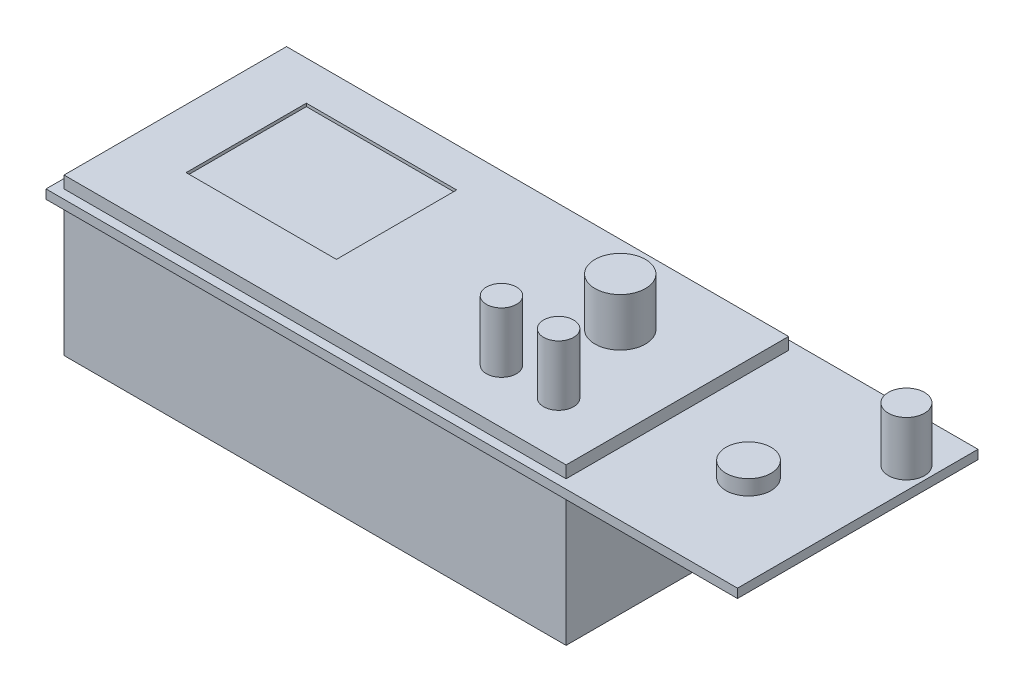
ISO-10303-21;
HEADER;
FILE_DESCRIPTION(('STEP AP214'),'2;1');
FILE_NAME('part.step','',(''),(''),'','','');
FILE_SCHEMA(('AUTOMOTIVE_DESIGN { 1 0 10303 214 1 1 1 1 }'));
ENDSEC;
DATA;
#1=APPLICATION_CONTEXT('core data for automotive mechanical design processes');
#2=APPLICATION_PROTOCOL_DEFINITION('international standard','automotive_design',2000,#1);
#3=PRODUCT_CONTEXT('',#1,'mechanical');
#4=PRODUCT('Part','Part','',(#3));
#5=PRODUCT_RELATED_PRODUCT_CATEGORY('part','',(#4));
#6=PRODUCT_DEFINITION_FORMATION('','',#4);
#7=PRODUCT_DEFINITION_CONTEXT('part definition',#1,'design');
#8=PRODUCT_DEFINITION('design','',#6,#7);
#9=PRODUCT_DEFINITION_SHAPE('','',#8);
#10=(LENGTH_UNIT() NAMED_UNIT(*) SI_UNIT(.MILLI.,.METRE.));
#11=(NAMED_UNIT(*) PLANE_ANGLE_UNIT() SI_UNIT($,.RADIAN.));
#12=(NAMED_UNIT(*) SI_UNIT($,.STERADIAN.) SOLID_ANGLE_UNIT());
#13=UNCERTAINTY_MEASURE_WITH_UNIT(LENGTH_MEASURE(1.E-05),#10,'distance_accuracy_value','');
#14=(GEOMETRIC_REPRESENTATION_CONTEXT(3) GLOBAL_UNCERTAINTY_ASSIGNED_CONTEXT((#13)) GLOBAL_UNIT_ASSIGNED_CONTEXT((#10,
#11,#12)) REPRESENTATION_CONTEXT('',''));
#15=CARTESIAN_POINT('',(0.,0.,0.));
#16=DIRECTION('',(0.,0.,1.));
#17=DIRECTION('',(1.,0.,0.));
#18=AXIS2_PLACEMENT_3D('',#15,#16,#17);
#19=CARTESIAN_POINT('',(0.,0.,0.));
#20=DIRECTION('',(0.,1.,0.));
#21=DIRECTION('',(0.,0.,1.));
#22=AXIS2_PLACEMENT_3D('',#19,#20,#21);
#23=PLANE('',#22);
#24=DIRECTION('',(0.,0.,1.));
#25=VECTOR('',#24,1.);
#26=CARTESIAN_POINT('',(-79.624134520277,0.,-38.2195845697328));
#27=LINE('',#26,#25);
#28=CARTESIAN_POINT('',(-79.624134520277,0.,-38.2195845697328));
#29=VERTEX_POINT('',#28);
#30=CARTESIAN_POINT('',(-79.624134520277,0.,41.7804154302672));
#31=VERTEX_POINT('',#30);
#32=EDGE_CURVE('E313',#29,#31,#27,.T.);
#33=ORIENTED_EDGE('',*,*,#32,.F.);
#34=DIRECTION('',(-1.,0.,0.));
#35=VECTOR('',#34,1.);
#36=CARTESIAN_POINT('',(-79.624134520277,0.,-38.2195845697328));
#37=LINE('',#36,#35);
#38=CARTESIAN_POINT('',(150.375865479723,0.,-38.2195845697328));
#39=VERTEX_POINT('',#38);
#40=EDGE_CURVE('E319',#39,#29,#37,.T.);
#41=ORIENTED_EDGE('',*,*,#40,.F.);
#42=DIRECTION('',(0.,0.,-1.));
#43=VECTOR('',#42,1.);
#44=CARTESIAN_POINT('',(150.375865479723,0.,-38.2195845697328));
#45=LINE('',#44,#43);
#46=CARTESIAN_POINT('',(150.375865479723,0.,41.7804154302672));
#47=VERTEX_POINT('',#46);
#48=EDGE_CURVE('E335',#47,#39,#45,.T.);
#49=ORIENTED_EDGE('',*,*,#48,.F.);
#50=DIRECTION('',(1.,0.,0.));
#51=VECTOR('',#50,1.);
#52=CARTESIAN_POINT('',(-79.624134520277,0.,41.7804154302672));
#53=LINE('',#52,#51);
#54=EDGE_CURVE('E332',#31,#47,#53,.T.);
#55=ORIENTED_EDGE('',*,*,#54,.F.);
#56=EDGE_LOOP('',(#33,#41,#49,#55));
#57=FACE_BOUND('',#56,.T.);
#58=DIRECTION('',(0.,0.,-1.));
#59=VECTOR('',#58,1.);
#60=CARTESIAN_POINT('',(-76.624134520277,0.,38.7804154302672));
#61=LINE('',#60,#59);
#62=CARTESIAN_POINT('',(-76.624134520277,0.,38.7804154302672));
#63=VERTEX_POINT('',#62);
#64=CARTESIAN_POINT('',(-76.6241345202769,0.,-35.2195845697328));
#65=VERTEX_POINT('',#64);
#66=EDGE_CURVE('E57',#63,#65,#61,.T.);
#67=ORIENTED_EDGE('',*,*,#66,.F.);
#68=DIRECTION('',(-1.,0.,0.));
#69=VECTOR('',#68,1.);
#70=CARTESIAN_POINT('',(-76.624134520277,0.,38.7804154302672));
#71=LINE('',#70,#69);
#72=CARTESIAN_POINT('',(90.375865479723,0.,38.7804154302672));
#73=VERTEX_POINT('',#72);
#74=EDGE_CURVE('E61',#73,#63,#71,.T.);
#75=ORIENTED_EDGE('',*,*,#74,.F.);
#76=DIRECTION('',(0.,0.,1.));
#77=VECTOR('',#76,1.);
#78=CARTESIAN_POINT('',(90.375865479723,0.,38.7804154302672));
#79=LINE('',#78,#77);
#80=CARTESIAN_POINT('',(90.3758654797231,0.,-35.2195845697328));
#81=VERTEX_POINT('',#80);
#82=EDGE_CURVE('E701',#81,#73,#79,.T.);
#83=ORIENTED_EDGE('',*,*,#82,.F.);
#84=DIRECTION('',(1.,0.,0.));
#85=VECTOR('',#84,1.);
#86=CARTESIAN_POINT('',(-76.6241345202769,0.,-35.2195845697328));
#87=LINE('',#86,#85);
#88=EDGE_CURVE('E711',#65,#81,#87,.T.);
#89=ORIENTED_EDGE('',*,*,#88,.F.);
#90=EDGE_LOOP('',(#67,#75,#83,#89));
#91=FACE_BOUND('',#90,.T.);
#92=ADVANCED_FACE('F41',(#57,#91),#23,.F.);
#93=CARTESIAN_POINT('',(-79.624134520277,3.,-38.2195845697328));
#94=DIRECTION('',(1.,0.,0.));
#95=DIRECTION('',(0.,0.,-1.));
#96=AXIS2_PLACEMENT_3D('',#93,#94,#95);
#97=PLANE('',#96);
#98=ORIENTED_EDGE('',*,*,#32,.T.);
#99=DIRECTION('',(0.,-1.,0.));
#100=VECTOR('',#99,1.);
#101=CARTESIAN_POINT('',(-79.624134520277,3.,41.7804154302672));
#102=LINE('',#101,#100);
#103=CARTESIAN_POINT('',(-79.624134520277,3.,41.7804154302672));
#104=VERTEX_POINT('',#103);
#105=EDGE_CURVE('E11',#104,#31,#102,.T.);
#106=ORIENTED_EDGE('',*,*,#105,.F.);
#107=DIRECTION('',(0.,0.,1.));
#108=VECTOR('',#107,1.);
#109=CARTESIAN_POINT('',(-79.624134520277,3.,-38.2195845697328));
#110=LINE('',#109,#108);
#111=CARTESIAN_POINT('',(-79.624134520277,3.,-38.2195845697328));
#112=VERTEX_POINT('',#111);
#113=EDGE_CURVE('E314',#112,#104,#110,.T.);
#114=ORIENTED_EDGE('',*,*,#113,.F.);
#115=DIRECTION('',(0.,-1.,0.));
#116=VECTOR('',#115,1.);
#117=CARTESIAN_POINT('',(-79.624134520277,3.,-38.2195845697328));
#118=LINE('',#117,#116);
#119=EDGE_CURVE('E328',#112,#29,#118,.T.);
#120=ORIENTED_EDGE('',*,*,#119,.T.);
#121=EDGE_LOOP('',(#98,#106,#114,#120));
#122=FACE_BOUND('',#121,.T.);
#123=ADVANCED_FACE('F43',(#122),#97,.F.);
#124=CARTESIAN_POINT('',(-79.624134520277,3.,41.7804154302672));
#125=DIRECTION('',(0.,0.,-1.));
#126=DIRECTION('',(-1.,0.,0.));
#127=AXIS2_PLACEMENT_3D('',#124,#125,#126);
#128=PLANE('',#127);
#129=ORIENTED_EDGE('',*,*,#54,.T.);
#130=DIRECTION('',(0.,-1.,0.));
#131=VECTOR('',#130,1.);
#132=CARTESIAN_POINT('',(150.375865479723,3.,41.7804154302672));
#133=LINE('',#132,#131);
#134=CARTESIAN_POINT('',(150.375865479723,3.,41.7804154302672));
#135=VERTEX_POINT('',#134);
#136=EDGE_CURVE('E50',#135,#47,#133,.T.);
#137=ORIENTED_EDGE('',*,*,#136,.F.);
#138=DIRECTION('',(1.,0.,0.));
#139=VECTOR('',#138,1.);
#140=CARTESIAN_POINT('',(-79.624134520277,3.,41.7804154302672));
#141=LINE('',#140,#139);
#142=EDGE_CURVE('E318',#104,#135,#141,.T.);
#143=ORIENTED_EDGE('',*,*,#142,.F.);
#144=ORIENTED_EDGE('',*,*,#105,.T.);
#145=EDGE_LOOP('',(#129,#137,#143,#144));
#146=FACE_BOUND('',#145,.T.);
#147=ADVANCED_FACE('F367',(#146),#128,.F.);
#148=CARTESIAN_POINT('',(150.375865479723,3.,-38.2195845697328));
#149=DIRECTION('',(-1.,0.,0.));
#150=DIRECTION('',(0.,0.,1.));
#151=AXIS2_PLACEMENT_3D('',#148,#149,#150);
#152=PLANE('',#151);
#153=ORIENTED_EDGE('',*,*,#48,.T.);
#154=DIRECTION('',(0.,-1.,0.));
#155=VECTOR('',#154,1.);
#156=CARTESIAN_POINT('',(150.375865479723,3.,-38.2195845697328));
#157=LINE('',#156,#155);
#158=CARTESIAN_POINT('',(150.375865479723,3.,-38.2195845697328));
#159=VERTEX_POINT('',#158);
#160=EDGE_CURVE('E343',#159,#39,#157,.T.);
#161=ORIENTED_EDGE('',*,*,#160,.F.);
#162=DIRECTION('',(0.,0.,-1.));
#163=VECTOR('',#162,1.);
#164=CARTESIAN_POINT('',(150.375865479723,3.,-38.2195845697328));
#165=LINE('',#164,#163);
#166=EDGE_CURVE('E322',#135,#159,#165,.T.);
#167=ORIENTED_EDGE('',*,*,#166,.F.);
#168=ORIENTED_EDGE('',*,*,#136,.T.);
#169=EDGE_LOOP('',(#153,#161,#167,#168));
#170=FACE_BOUND('',#169,.T.);
#171=ADVANCED_FACE('F352',(#170),#152,.F.);
#172=CARTESIAN_POINT('',(-79.624134520277,3.,-38.2195845697328));
#173=DIRECTION('',(0.,0.,1.));
#174=DIRECTION('',(1.,0.,0.));
#175=AXIS2_PLACEMENT_3D('',#172,#173,#174);
#176=PLANE('',#175);
#177=ORIENTED_EDGE('',*,*,#40,.T.);
#178=ORIENTED_EDGE('',*,*,#119,.F.);
#179=DIRECTION('',(-1.,0.,0.));
#180=VECTOR('',#179,1.);
#181=CARTESIAN_POINT('',(-79.624134520277,3.,-38.2195845697328));
#182=LINE('',#181,#180);
#183=EDGE_CURVE('E325',#159,#112,#182,.T.);
#184=ORIENTED_EDGE('',*,*,#183,.F.);
#185=ORIENTED_EDGE('',*,*,#160,.T.);
#186=EDGE_LOOP('',(#177,#178,#184,#185));
#187=FACE_BOUND('',#186,.T.);
#188=ADVANCED_FACE('F360',(#187),#176,.F.);
#189=CARTESIAN_POINT('',(0.,3.,0.));
#190=DIRECTION('',(0.,1.,0.));
#191=DIRECTION('',(0.,0.,1.));
#192=AXIS2_PLACEMENT_3D('',#189,#190,#191);
#193=PLANE('',#192);
#194=CARTESIAN_POINT('',(120.375865479723,3.,8.10842044145851));
#195=DIRECTION('',(0.,1.,0.));
#196=DIRECTION('',(0.,0.,1.));
#197=AXIS2_PLACEMENT_3D('',#194,#195,#196);
#198=CIRCLE('',#197,7.50000000000003);
#199=CARTESIAN_POINT('',(120.375865479723,3.,15.6084204414585));
#200=VERTEX_POINT('',#199);
#201=EDGE_CURVE('E178',#200,#200,#198,.T.);
#202=ORIENTED_EDGE('',*,*,#201,.F.);
#203=EDGE_LOOP('',(#202));
#204=FACE_BOUND('',#203,.T.);
#205=CARTESIAN_POINT('',(143.075865479723,3.,-21.7195845697328));
#206=DIRECTION('',(0.,1.,0.));
#207=DIRECTION('',(0.,0.,1.));
#208=AXIS2_PLACEMENT_3D('',#205,#206,#207);
#209=CIRCLE('',#208,6.00000000000002);
#210=CARTESIAN_POINT('',(143.075865479723,3.,-15.7195845697328));
#211=VERTEX_POINT('',#210);
#212=EDGE_CURVE('E191',#211,#211,#209,.T.);
#213=ORIENTED_EDGE('',*,*,#212,.F.);
#214=EDGE_LOOP('',(#213));
#215=FACE_BOUND('',#214,.T.);
#216=DIRECTION('',(0.,0.,1.));
#217=VECTOR('',#216,1.);
#218=CARTESIAN_POINT('',(-76.624134520277,3.,-35.2195845697328));
#219=LINE('',#218,#217);
#220=CARTESIAN_POINT('',(-76.624134520277,3.,-35.2195845697328));
#221=VERTEX_POINT('',#220);
#222=CARTESIAN_POINT('',(-76.6241345202769,3.,38.7804154302672));
#223=VERTEX_POINT('',#222);
#224=EDGE_CURVE('E259',#221,#223,#219,.T.);
#225=ORIENTED_EDGE('',*,*,#224,.F.);
#226=DIRECTION('',(-1.,0.,0.));
#227=VECTOR('',#226,1.);
#228=CARTESIAN_POINT('',(-76.624134520277,3.,-35.2195845697328));
#229=LINE('',#228,#227);
#230=CARTESIAN_POINT('',(90.375865479723,3.,-35.2195845697328));
#231=VERTEX_POINT('',#230);
#232=EDGE_CURVE('E274',#231,#221,#229,.T.);
#233=ORIENTED_EDGE('',*,*,#232,.F.);
#234=DIRECTION('',(0.,0.,-1.));
#235=VECTOR('',#234,1.);
#236=CARTESIAN_POINT('',(90.375865479723,3.,-35.2195845697328));
#237=LINE('',#236,#235);
#238=CARTESIAN_POINT('',(90.3758654797231,3.,38.7804154302672));
#239=VERTEX_POINT('',#238);
#240=EDGE_CURVE('E291',#239,#231,#237,.T.);
#241=ORIENTED_EDGE('',*,*,#240,.F.);
#242=DIRECTION('',(1.,0.,0.));
#243=VECTOR('',#242,1.);
#244=CARTESIAN_POINT('',(-76.6241345202769,3.,38.7804154302672));
#245=LINE('',#244,#243);
#246=EDGE_CURVE('E287',#223,#239,#245,.T.);
#247=ORIENTED_EDGE('',*,*,#246,.F.);
#248=EDGE_LOOP('',(#225,#233,#241,#247));
#249=FACE_BOUND('',#248,.T.);
#250=ORIENTED_EDGE('',*,*,#113,.T.);
#251=ORIENTED_EDGE('',*,*,#142,.T.);
#252=ORIENTED_EDGE('',*,*,#166,.T.);
#253=ORIENTED_EDGE('',*,*,#183,.T.);
#254=EDGE_LOOP('',(#250,#251,#252,#253));
#255=FACE_BOUND('',#254,.T.);
#256=ADVANCED_FACE('F366',(#204,#215,#249,#255),#193,.T.);
#257=CARTESIAN_POINT('',(-76.624134520277,7.,-35.2195845697328));
#258=DIRECTION('',(1.,0.,0.));
#259=DIRECTION('',(0.,0.,-1.));
#260=AXIS2_PLACEMENT_3D('',#257,#258,#259);
#261=PLANE('',#260);
#262=ORIENTED_EDGE('',*,*,#224,.T.);
#263=DIRECTION('',(0.,-1.,0.));
#264=VECTOR('',#263,1.);
#265=CARTESIAN_POINT('',(-76.6241345202769,7.,38.7804154302672));
#266=LINE('',#265,#264);
#267=CARTESIAN_POINT('',(-76.6241345202769,7.,38.7804154302672));
#268=VERTEX_POINT('',#267);
#269=EDGE_CURVE('E309',#268,#223,#266,.T.);
#270=ORIENTED_EDGE('',*,*,#269,.F.);
#271=DIRECTION('',(0.,0.,1.));
#272=VECTOR('',#271,1.);
#273=CARTESIAN_POINT('',(-76.624134520277,7.,-35.2195845697328));
#274=LINE('',#273,#272);
#275=CARTESIAN_POINT('',(-76.624134520277,7.,-35.2195845697328));
#276=VERTEX_POINT('',#275);
#277=EDGE_CURVE('E269',#276,#268,#274,.T.);
#278=ORIENTED_EDGE('',*,*,#277,.F.);
#279=DIRECTION('',(0.,-1.,0.));
#280=VECTOR('',#279,1.);
#281=CARTESIAN_POINT('',(-76.624134520277,7.,-35.2195845697328));
#282=LINE('',#281,#280);
#283=EDGE_CURVE('E283',#276,#221,#282,.T.);
#284=ORIENTED_EDGE('',*,*,#283,.T.);
#285=EDGE_LOOP('',(#262,#270,#278,#284));
#286=FACE_BOUND('',#285,.T.);
#287=ADVANCED_FACE('F385',(#286),#261,.F.);
#288=CARTESIAN_POINT('',(-76.6241345202769,7.,38.7804154302672));
#289=DIRECTION('',(0.,0.,-1.));
#290=DIRECTION('',(-1.,0.,0.));
#291=AXIS2_PLACEMENT_3D('',#288,#289,#290);
#292=PLANE('',#291);
#293=ORIENTED_EDGE('',*,*,#246,.T.);
#294=DIRECTION('',(0.,-1.,0.));
#295=VECTOR('',#294,1.);
#296=CARTESIAN_POINT('',(90.3758654797231,7.,38.7804154302672));
#297=LINE('',#296,#295);
#298=CARTESIAN_POINT('',(90.3758654797231,7.,38.7804154302672));
#299=VERTEX_POINT('',#298);
#300=EDGE_CURVE('E305',#299,#239,#297,.T.);
#301=ORIENTED_EDGE('',*,*,#300,.F.);
#302=DIRECTION('',(1.,0.,0.));
#303=VECTOR('',#302,1.);
#304=CARTESIAN_POINT('',(-76.6241345202769,7.,38.7804154302672));
#305=LINE('',#304,#303);
#306=EDGE_CURVE('E273',#268,#299,#305,.T.);
#307=ORIENTED_EDGE('',*,*,#306,.F.);
#308=ORIENTED_EDGE('',*,*,#269,.T.);
#309=EDGE_LOOP('',(#293,#301,#307,#308));
#310=FACE_BOUND('',#309,.T.);
#311=ADVANCED_FACE('F390',(#310),#292,.F.);
#312=CARTESIAN_POINT('',(90.375865479723,7.,-35.2195845697328));
#313=DIRECTION('',(-1.,0.,0.));
#314=DIRECTION('',(0.,0.,1.));
#315=AXIS2_PLACEMENT_3D('',#312,#313,#314);
#316=PLANE('',#315);
#317=ORIENTED_EDGE('',*,*,#240,.T.);
#318=DIRECTION('',(0.,-1.,0.));
#319=VECTOR('',#318,1.);
#320=CARTESIAN_POINT('',(90.375865479723,7.,-35.2195845697328));
#321=LINE('',#320,#319);
#322=CARTESIAN_POINT('',(90.375865479723,7.,-35.2195845697328));
#323=VERTEX_POINT('',#322);
#324=EDGE_CURVE('E301',#323,#231,#321,.T.);
#325=ORIENTED_EDGE('',*,*,#324,.F.);
#326=DIRECTION('',(0.,0.,-1.));
#327=VECTOR('',#326,1.);
#328=CARTESIAN_POINT('',(90.375865479723,7.,-35.2195845697328));
#329=LINE('',#328,#327);
#330=EDGE_CURVE('E277',#299,#323,#329,.T.);
#331=ORIENTED_EDGE('',*,*,#330,.F.);
#332=ORIENTED_EDGE('',*,*,#300,.T.);
#333=EDGE_LOOP('',(#317,#325,#331,#332));
#334=FACE_BOUND('',#333,.T.);
#335=ADVANCED_FACE('F408',(#334),#316,.F.);
#336=CARTESIAN_POINT('',(-76.624134520277,7.,-35.2195845697328));
#337=DIRECTION('',(0.,0.,1.));
#338=DIRECTION('',(1.,0.,0.));
#339=AXIS2_PLACEMENT_3D('',#336,#337,#338);
#340=PLANE('',#339);
#341=ORIENTED_EDGE('',*,*,#232,.T.);
#342=ORIENTED_EDGE('',*,*,#283,.F.);
#343=DIRECTION('',(-1.,0.,0.));
#344=VECTOR('',#343,1.);
#345=CARTESIAN_POINT('',(-76.624134520277,7.,-35.2195845697328));
#346=LINE('',#345,#344);
#347=EDGE_CURVE('E280',#323,#276,#346,.T.);
#348=ORIENTED_EDGE('',*,*,#347,.F.);
#349=ORIENTED_EDGE('',*,*,#324,.T.);
#350=EDGE_LOOP('',(#341,#342,#348,#349));
#351=FACE_BOUND('',#350,.T.);
#352=ADVANCED_FACE('F399',(#351),#340,.F.);
#353=CARTESIAN_POINT('',(0.,7.,0.));
#354=DIRECTION('',(0.,1.,0.));
#355=DIRECTION('',(0.,0.,1.));
#356=AXIS2_PLACEMENT_3D('',#353,#354,#355);
#357=PLANE('',#356);
#358=CARTESIAN_POINT('',(50.8758654797231,7.,20.7804154302672));
#359=DIRECTION('',(0.,1.,0.));
#360=DIRECTION('',(0.,0.,1.));
#361=AXIS2_PLACEMENT_3D('',#358,#359,#360);
#362=CIRCLE('',#361,5.);
#363=CARTESIAN_POINT('',(50.8758654797231,7.,25.7804154302672));
#364=VERTEX_POINT('',#363);
#365=EDGE_CURVE('E197',#364,#364,#362,.T.);
#366=ORIENTED_EDGE('',*,*,#365,.F.);
#367=EDGE_LOOP('',(#366));
#368=FACE_BOUND('',#367,.T.);
#369=CARTESIAN_POINT('',(69.8758654797231,7.,20.7804154302672));
#370=DIRECTION('',(0.,1.,0.));
#371=DIRECTION('',(0.,0.,1.));
#372=AXIS2_PLACEMENT_3D('',#369,#370,#371);
#373=CIRCLE('',#372,5.);
#374=CARTESIAN_POINT('',(69.8758654797231,7.,25.7804154302672));
#375=VERTEX_POINT('',#374);
#376=EDGE_CURVE('E205',#375,#375,#373,.T.);
#377=ORIENTED_EDGE('',*,*,#376,.F.);
#378=EDGE_LOOP('',(#377));
#379=FACE_BOUND('',#378,.T.);
#380=CARTESIAN_POINT('',(60.3758654797231,7.,-9.21958456973284));
#381=DIRECTION('',(0.,1.,0.));
#382=DIRECTION('',(0.,0.,1.));
#383=AXIS2_PLACEMENT_3D('',#380,#381,#382);
#384=CIRCLE('',#383,8.4);
#385=CARTESIAN_POINT('',(60.3758654797231,7.,-0.819584569732837));
#386=VERTEX_POINT('',#385);
#387=EDGE_CURVE('E213',#386,#386,#384,.T.);
#388=ORIENTED_EDGE('',*,*,#387,.F.);
#389=EDGE_LOOP('',(#388));
#390=FACE_BOUND('',#389,.T.);
#391=DIRECTION('',(0.,0.,1.));
#392=VECTOR('',#391,1.);
#393=CARTESIAN_POINT('',(-57.024134520277,7.,-22.2195845697328));
#394=LINE('',#393,#392);
#395=CARTESIAN_POINT('',(-57.024134520277,7.,-22.2195845697328));
#396=VERTEX_POINT('',#395);
#397=CARTESIAN_POINT('',(-57.0241345202769,7.,17.7804154302672));
#398=VERTEX_POINT('',#397);
#399=EDGE_CURVE('E221',#396,#398,#394,.T.);
#400=ORIENTED_EDGE('',*,*,#399,.F.);
#401=DIRECTION('',(-1.,0.,0.));
#402=VECTOR('',#401,1.);
#403=CARTESIAN_POINT('',(-57.024134520277,7.,-22.2195845697328));
#404=LINE('',#403,#402);
#405=CARTESIAN_POINT('',(-7.02413452027695,7.,-22.2195845697328));
#406=VERTEX_POINT('',#405);
#407=EDGE_CURVE('E230',#406,#396,#404,.T.);
#408=ORIENTED_EDGE('',*,*,#407,.F.);
#409=DIRECTION('',(0.,0.,-1.));
#410=VECTOR('',#409,1.);
#411=CARTESIAN_POINT('',(-7.02413452027695,7.,-22.2195845697328));
#412=LINE('',#411,#410);
#413=CARTESIAN_POINT('',(-7.02413452027694,7.,17.7804154302672));
#414=VERTEX_POINT('',#413);
#415=EDGE_CURVE('E249',#414,#406,#412,.T.);
#416=ORIENTED_EDGE('',*,*,#415,.F.);
#417=DIRECTION('',(1.,0.,0.));
#418=VECTOR('',#417,1.);
#419=CARTESIAN_POINT('',(-57.0241345202769,7.,17.7804154302672));
#420=LINE('',#419,#418);
#421=EDGE_CURVE('E245',#398,#414,#420,.T.);
#422=ORIENTED_EDGE('',*,*,#421,.F.);
#423=EDGE_LOOP('',(#400,#408,#416,#422));
#424=FACE_BOUND('',#423,.T.);
#425=ORIENTED_EDGE('',*,*,#277,.T.);
#426=ORIENTED_EDGE('',*,*,#306,.T.);
#427=ORIENTED_EDGE('',*,*,#330,.T.);
#428=ORIENTED_EDGE('',*,*,#347,.T.);
#429=EDGE_LOOP('',(#425,#426,#427,#428));
#430=FACE_BOUND('',#429,.T.);
#431=ADVANCED_FACE('F404',(#368,#379,#390,#424,#430),#357,.T.);
#432=CARTESIAN_POINT('',(-57.024134520277,6.,-22.2195845697328));
#433=DIRECTION('',(-1.,0.,0.));
#434=DIRECTION('',(0.,0.,1.));
#435=AXIS2_PLACEMENT_3D('',#432,#433,#434);
#436=PLANE('',#435);
#437=ORIENTED_EDGE('',*,*,#399,.T.);
#438=DIRECTION('',(0.,1.,0.));
#439=VECTOR('',#438,1.);
#440=CARTESIAN_POINT('',(-57.0241345202769,6.,17.7804154302672));
#441=LINE('',#440,#439);
#442=CARTESIAN_POINT('',(-57.0241345202769,6.,17.7804154302672));
#443=VERTEX_POINT('',#442);
#444=EDGE_CURVE('E242',#443,#398,#441,.T.);
#445=ORIENTED_EDGE('',*,*,#444,.F.);
#446=DIRECTION('',(0.,0.,1.));
#447=VECTOR('',#446,1.);
#448=CARTESIAN_POINT('',(-57.024134520277,6.,-22.2195845697328));
#449=LINE('',#448,#447);
#450=CARTESIAN_POINT('',(-57.024134520277,6.,-22.2195845697328));
#451=VERTEX_POINT('',#450);
#452=EDGE_CURVE('E225',#451,#443,#449,.T.);
#453=ORIENTED_EDGE('',*,*,#452,.F.);
#454=DIRECTION('',(0.,1.,0.));
#455=VECTOR('',#454,1.);
#456=CARTESIAN_POINT('',(-57.024134520277,6.,-22.2195845697328));
#457=LINE('',#456,#455);
#458=EDGE_CURVE('E256',#451,#396,#457,.T.);
#459=ORIENTED_EDGE('',*,*,#458,.T.);
#460=EDGE_LOOP('',(#437,#445,#453,#459));
#461=FACE_BOUND('',#460,.T.);
#462=ADVANCED_FACE('F421',(#461),#436,.F.);
#463=CARTESIAN_POINT('',(-57.024134520277,6.,-22.2195845697328));
#464=DIRECTION('',(0.,0.,-1.));
#465=DIRECTION('',(-1.,0.,0.));
#466=AXIS2_PLACEMENT_3D('',#463,#464,#465);
#467=PLANE('',#466);
#468=ORIENTED_EDGE('',*,*,#407,.T.);
#469=ORIENTED_EDGE('',*,*,#458,.F.);
#470=DIRECTION('',(-1.,0.,0.));
#471=VECTOR('',#470,1.);
#472=CARTESIAN_POINT('',(-57.024134520277,6.,-22.2195845697328));
#473=LINE('',#472,#471);
#474=CARTESIAN_POINT('',(-7.02413452027695,6.,-22.2195845697328));
#475=VERTEX_POINT('',#474);
#476=EDGE_CURVE('E238',#475,#451,#473,.T.);
#477=ORIENTED_EDGE('',*,*,#476,.F.);
#478=DIRECTION('',(0.,1.,0.));
#479=VECTOR('',#478,1.);
#480=CARTESIAN_POINT('',(-7.02413452027695,6.,-22.2195845697328));
#481=LINE('',#480,#479);
#482=EDGE_CURVE('E260',#475,#406,#481,.T.);
#483=ORIENTED_EDGE('',*,*,#482,.T.);
#484=EDGE_LOOP('',(#468,#469,#477,#483));
#485=FACE_BOUND('',#484,.T.);
#486=ADVANCED_FACE('F425',(#485),#467,.F.);
#487=CARTESIAN_POINT('',(-7.02413452027695,6.,-22.2195845697328));
#488=DIRECTION('',(1.,0.,0.));
#489=DIRECTION('',(0.,0.,-1.));
#490=AXIS2_PLACEMENT_3D('',#487,#488,#489);
#491=PLANE('',#490);
#492=ORIENTED_EDGE('',*,*,#415,.T.);
#493=ORIENTED_EDGE('',*,*,#482,.F.);
#494=DIRECTION('',(0.,0.,-1.));
#495=VECTOR('',#494,1.);
#496=CARTESIAN_POINT('',(-7.02413452027695,6.,-22.2195845697328));
#497=LINE('',#496,#495);
#498=CARTESIAN_POINT('',(-7.02413452027694,6.,17.7804154302672));
#499=VERTEX_POINT('',#498);
#500=EDGE_CURVE('E234',#499,#475,#497,.T.);
#501=ORIENTED_EDGE('',*,*,#500,.F.);
#502=DIRECTION('',(0.,1.,0.));
#503=VECTOR('',#502,1.);
#504=CARTESIAN_POINT('',(-7.02413452027694,6.,17.7804154302672));
#505=LINE('',#504,#503);
#506=EDGE_CURVE('E263',#499,#414,#505,.T.);
#507=ORIENTED_EDGE('',*,*,#506,.T.);
#508=EDGE_LOOP('',(#492,#493,#501,#507));
#509=FACE_BOUND('',#508,.T.);
#510=ADVANCED_FACE('F431',(#509),#491,.F.);
#511=CARTESIAN_POINT('',(-57.0241345202769,6.,17.7804154302672));
#512=DIRECTION('',(0.,0.,1.));
#513=DIRECTION('',(1.,0.,0.));
#514=AXIS2_PLACEMENT_3D('',#511,#512,#513);
#515=PLANE('',#514);
#516=ORIENTED_EDGE('',*,*,#421,.T.);
#517=ORIENTED_EDGE('',*,*,#506,.F.);
#518=DIRECTION('',(1.,0.,0.));
#519=VECTOR('',#518,1.);
#520=CARTESIAN_POINT('',(-57.0241345202769,6.,17.7804154302672));
#521=LINE('',#520,#519);
#522=EDGE_CURVE('E229',#443,#499,#521,.T.);
#523=ORIENTED_EDGE('',*,*,#522,.F.);
#524=ORIENTED_EDGE('',*,*,#444,.T.);
#525=EDGE_LOOP('',(#516,#517,#523,#524));
#526=FACE_BOUND('',#525,.T.);
#527=ADVANCED_FACE('F427',(#526),#515,.F.);
#528=CARTESIAN_POINT('',(0.,6.,0.));
#529=DIRECTION('',(0.,1.,0.));
#530=DIRECTION('',(0.,0.,1.));
#531=AXIS2_PLACEMENT_3D('',#528,#529,#530);
#532=PLANE('',#531);
#533=ORIENTED_EDGE('',*,*,#452,.T.);
#534=ORIENTED_EDGE('',*,*,#522,.T.);
#535=ORIENTED_EDGE('',*,*,#500,.T.);
#536=ORIENTED_EDGE('',*,*,#476,.T.);
#537=EDGE_LOOP('',(#533,#534,#535,#536));
#538=FACE_BOUND('',#537,.T.);
#539=ADVANCED_FACE('F430',(#538),#532,.T.);
#540=CARTESIAN_POINT('',(60.3758654797231,23.,-9.21958456973284));
#541=DIRECTION('',(0.,-1.,0.));
#542=DIRECTION('',(0.,0.,-1.));
#543=AXIS2_PLACEMENT_3D('',#540,#541,#542);
#544=CYLINDRICAL_SURFACE('',#543,8.4);
#545=CARTESIAN_POINT('',(60.3758654797231,23.,-9.21958456973284));
#546=DIRECTION('',(0.,1.,0.));
#547=DIRECTION('',(0.,0.,1.));
#548=AXIS2_PLACEMENT_3D('',#545,#546,#547);
#549=CIRCLE('',#548,8.4);
#550=CARTESIAN_POINT('',(60.3758654797231,23.,-0.819584569732837));
#551=VERTEX_POINT('',#550);
#552=EDGE_CURVE('E217',#551,#551,#549,.T.);
#553=ORIENTED_EDGE('',*,*,#552,.F.);
#554=EDGE_LOOP('',(#553));
#555=FACE_BOUND('',#554,.T.);
#556=ORIENTED_EDGE('',*,*,#387,.T.);
#557=EDGE_LOOP('',(#556));
#558=FACE_BOUND('',#557,.T.);
#559=ADVANCED_FACE('F441',(#555,#558),#544,.T.);
#560=CARTESIAN_POINT('',(60.3758654797231,23.,-9.21958456973284));
#561=DIRECTION('',(0.,1.,0.));
#562=DIRECTION('',(0.,0.,1.));
#563=AXIS2_PLACEMENT_3D('',#560,#561,#562);
#564=PLANE('',#563);
#565=ORIENTED_EDGE('',*,*,#552,.T.);
#566=EDGE_LOOP('',(#565));
#567=FACE_BOUND('',#566,.T.);
#568=ADVANCED_FACE('F445',(#567),#564,.T.);
#569=CARTESIAN_POINT('',(69.8758654797231,27.,20.7804154302672));
#570=DIRECTION('',(0.,-1.,0.));
#571=DIRECTION('',(0.,0.,-1.));
#572=AXIS2_PLACEMENT_3D('',#569,#570,#571);
#573=CYLINDRICAL_SURFACE('',#572,5.);
#574=CARTESIAN_POINT('',(69.8758654797231,27.,20.7804154302672));
#575=DIRECTION('',(0.,1.,0.));
#576=DIRECTION('',(0.,0.,1.));
#577=AXIS2_PLACEMENT_3D('',#574,#575,#576);
#578=CIRCLE('',#577,5.);
#579=CARTESIAN_POINT('',(69.8758654797231,27.,25.7804154302672));
#580=VERTEX_POINT('',#579);
#581=EDGE_CURVE('E209',#580,#580,#578,.T.);
#582=ORIENTED_EDGE('',*,*,#581,.F.);
#583=EDGE_LOOP('',(#582));
#584=FACE_BOUND('',#583,.T.);
#585=ORIENTED_EDGE('',*,*,#376,.T.);
#586=EDGE_LOOP('',(#585));
#587=FACE_BOUND('',#586,.T.);
#588=ADVANCED_FACE('F449',(#584,#587),#573,.T.);
#589=CARTESIAN_POINT('',(69.8758654797231,27.,20.7804154302672));
#590=DIRECTION('',(0.,1.,0.));
#591=DIRECTION('',(0.,0.,1.));
#592=AXIS2_PLACEMENT_3D('',#589,#590,#591);
#593=PLANE('',#592);
#594=ORIENTED_EDGE('',*,*,#581,.T.);
#595=EDGE_LOOP('',(#594));
#596=FACE_BOUND('',#595,.T.);
#597=ADVANCED_FACE('F453',(#596),#593,.T.);
#598=CARTESIAN_POINT('',(50.8758654797231,27.,20.7804154302672));
#599=DIRECTION('',(0.,-1.,0.));
#600=DIRECTION('',(0.,0.,-1.));
#601=AXIS2_PLACEMENT_3D('',#598,#599,#600);
#602=CYLINDRICAL_SURFACE('',#601,5.);
#603=CARTESIAN_POINT('',(50.8758654797231,27.,20.7804154302672));
#604=DIRECTION('',(0.,1.,0.));
#605=DIRECTION('',(0.,0.,1.));
#606=AXIS2_PLACEMENT_3D('',#603,#604,#605);
#607=CIRCLE('',#606,5.);
#608=CARTESIAN_POINT('',(50.8758654797231,27.,25.7804154302672));
#609=VERTEX_POINT('',#608);
#610=EDGE_CURVE('E201',#609,#609,#607,.T.);
#611=ORIENTED_EDGE('',*,*,#610,.F.);
#612=EDGE_LOOP('',(#611));
#613=FACE_BOUND('',#612,.T.);
#614=ORIENTED_EDGE('',*,*,#365,.T.);
#615=EDGE_LOOP('',(#614));
#616=FACE_BOUND('',#615,.T.);
#617=ADVANCED_FACE('F457',(#613,#616),#602,.T.);
#618=CARTESIAN_POINT('',(50.8758654797231,27.,20.7804154302672));
#619=DIRECTION('',(0.,1.,0.));
#620=DIRECTION('',(0.,0.,1.));
#621=AXIS2_PLACEMENT_3D('',#618,#619,#620);
#622=PLANE('',#621);
#623=ORIENTED_EDGE('',*,*,#610,.T.);
#624=EDGE_LOOP('',(#623));
#625=FACE_BOUND('',#624,.T.);
#626=ADVANCED_FACE('F461',(#625),#622,.T.);
#627=CARTESIAN_POINT('',(143.075865479723,21.,-21.7195845697328));
#628=DIRECTION('',(0.,-1.,0.));
#629=DIRECTION('',(0.,0.,-1.));
#630=AXIS2_PLACEMENT_3D('',#627,#628,#629);
#631=CYLINDRICAL_SURFACE('',#630,6.00000000000002);
#632=CARTESIAN_POINT('',(143.075865479723,21.,-21.7195845697328));
#633=DIRECTION('',(0.,1.,0.));
#634=DIRECTION('',(0.,0.,1.));
#635=AXIS2_PLACEMENT_3D('',#632,#633,#634);
#636=CIRCLE('',#635,6.00000000000002);
#637=CARTESIAN_POINT('',(143.075865479723,21.,-15.7195845697328));
#638=VERTEX_POINT('',#637);
#639=EDGE_CURVE('E193',#638,#638,#636,.T.);
#640=ORIENTED_EDGE('',*,*,#639,.F.);
#641=EDGE_LOOP('',(#640));
#642=FACE_BOUND('',#641,.T.);
#643=ORIENTED_EDGE('',*,*,#212,.T.);
#644=EDGE_LOOP('',(#643));
#645=FACE_BOUND('',#644,.T.);
#646=ADVANCED_FACE('F465',(#642,#645),#631,.T.);
#647=CARTESIAN_POINT('',(143.075865479723,21.,-21.7195845697328));
#648=DIRECTION('',(0.,1.,0.));
#649=DIRECTION('',(0.,0.,1.));
#650=AXIS2_PLACEMENT_3D('',#647,#648,#649);
#651=PLANE('',#650);
#652=ORIENTED_EDGE('',*,*,#639,.T.);
#653=EDGE_LOOP('',(#652));
#654=FACE_BOUND('',#653,.T.);
#655=ADVANCED_FACE('F469',(#654),#651,.T.);
#656=CARTESIAN_POINT('',(120.375865479723,8.,8.10842044145851));
#657=DIRECTION('',(0.,-1.,0.));
#658=DIRECTION('',(0.,0.,-1.));
#659=AXIS2_PLACEMENT_3D('',#656,#657,#658);
#660=CYLINDRICAL_SURFACE('',#659,7.50000000000003);
#661=CARTESIAN_POINT('',(120.375865479723,8.,8.10842044145851));
#662=DIRECTION('',(0.,1.,0.));
#663=DIRECTION('',(0.,0.,1.));
#664=AXIS2_PLACEMENT_3D('',#661,#662,#663);
#665=CIRCLE('',#664,7.50000000000003);
#666=CARTESIAN_POINT('',(120.375865479723,8.,15.6084204414585));
#667=VERTEX_POINT('',#666);
#668=EDGE_CURVE('E183',#667,#667,#665,.T.);
#669=ORIENTED_EDGE('',*,*,#668,.F.);
#670=EDGE_LOOP('',(#669));
#671=FACE_BOUND('',#670,.T.);
#672=ORIENTED_EDGE('',*,*,#201,.T.);
#673=EDGE_LOOP('',(#672));
#674=FACE_BOUND('',#673,.T.);
#675=ADVANCED_FACE('F473',(#671,#674),#660,.T.);
#676=CARTESIAN_POINT('',(120.375865479723,8.,8.10842044145851));
#677=DIRECTION('',(0.,1.,0.));
#678=DIRECTION('',(0.,0.,1.));
#679=AXIS2_PLACEMENT_3D('',#676,#677,#678);
#680=PLANE('',#679);
#681=ORIENTED_EDGE('',*,*,#668,.T.);
#682=EDGE_LOOP('',(#681));
#683=FACE_BOUND('',#682,.T.);
#684=ADVANCED_FACE('F477',(#683),#680,.T.);
#685=CARTESIAN_POINT('',(-76.624134520277,-45.,38.7804154302672));
#686=DIRECTION('',(1.,0.,0.));
#687=DIRECTION('',(0.,0.,-1.));
#688=AXIS2_PLACEMENT_3D('',#685,#686,#687);
#689=PLANE('',#688);
#690=ORIENTED_EDGE('',*,*,#66,.T.);
#691=DIRECTION('',(0.,1.,0.));
#692=VECTOR('',#691,1.);
#693=CARTESIAN_POINT('',(-76.6241345202769,-45.,-35.2195845697328));
#694=LINE('',#693,#692);
#695=CARTESIAN_POINT('',(-76.6241345202769,-45.,-35.2195845697328));
#696=VERTEX_POINT('',#695);
#697=EDGE_CURVE('E158',#696,#65,#694,.T.);
#698=ORIENTED_EDGE('',*,*,#697,.F.);
#699=DIRECTION('',(0.,0.,-1.));
#700=VECTOR('',#699,1.);
#701=CARTESIAN_POINT('',(-76.624134520277,-45.,38.7804154302672));
#702=LINE('',#701,#700);
#703=CARTESIAN_POINT('',(-76.624134520277,-45.,38.7804154302672));
#704=VERTEX_POINT('',#703);
#705=EDGE_CURVE('E165',#704,#696,#702,.T.);
#706=ORIENTED_EDGE('',*,*,#705,.F.);
#707=DIRECTION('',(0.,1.,0.));
#708=VECTOR('',#707,1.);
#709=CARTESIAN_POINT('',(-76.624134520277,-45.,38.7804154302672));
#710=LINE('',#709,#708);
#711=EDGE_CURVE('E698',#704,#63,#710,.T.);
#712=ORIENTED_EDGE('',*,*,#711,.T.);
#713=EDGE_LOOP('',(#690,#698,#706,#712));
#714=FACE_BOUND('',#713,.T.);
#715=ADVANCED_FACE('F176',(#714),#689,.F.);
#716=CARTESIAN_POINT('',(-76.6241345202769,-45.,-35.2195845697328));
#717=DIRECTION('',(0.,0.,1.));
#718=DIRECTION('',(1.,0.,0.));
#719=AXIS2_PLACEMENT_3D('',#716,#717,#718);
#720=PLANE('',#719);
#721=ORIENTED_EDGE('',*,*,#88,.T.);
#722=DIRECTION('',(0.,1.,0.));
#723=VECTOR('',#722,1.);
#724=CARTESIAN_POINT('',(90.3758654797231,-45.,-35.2195845697328));
#725=LINE('',#724,#723);
#726=CARTESIAN_POINT('',(90.3758654797231,-45.,-35.2195845697328));
#727=VERTEX_POINT('',#726);
#728=EDGE_CURVE('E160',#727,#81,#725,.T.);
#729=ORIENTED_EDGE('',*,*,#728,.F.);
#730=DIRECTION('',(1.,0.,0.));
#731=VECTOR('',#730,1.);
#732=CARTESIAN_POINT('',(-76.6241345202769,-45.,-35.2195845697328));
#733=LINE('',#732,#731);
#734=EDGE_CURVE('E153',#696,#727,#733,.T.);
#735=ORIENTED_EDGE('',*,*,#734,.F.);
#736=ORIENTED_EDGE('',*,*,#697,.T.);
#737=EDGE_LOOP('',(#721,#729,#735,#736));
#738=FACE_BOUND('',#737,.T.);
#739=ADVANCED_FACE('F156',(#738),#720,.F.);
#740=CARTESIAN_POINT('',(90.375865479723,-45.,38.7804154302672));
#741=DIRECTION('',(-1.,0.,0.));
#742=DIRECTION('',(0.,0.,1.));
#743=AXIS2_PLACEMENT_3D('',#740,#741,#742);
#744=PLANE('',#743);
#745=ORIENTED_EDGE('',*,*,#82,.T.);
#746=DIRECTION('',(0.,1.,0.));
#747=VECTOR('',#746,1.);
#748=CARTESIAN_POINT('',(90.375865479723,-45.,38.7804154302672));
#749=LINE('',#748,#747);
#750=CARTESIAN_POINT('',(90.375865479723,-45.,38.7804154302672));
#751=VERTEX_POINT('',#750);
#752=EDGE_CURVE('E185',#751,#73,#749,.T.);
#753=ORIENTED_EDGE('',*,*,#752,.F.);
#754=DIRECTION('',(0.,0.,1.));
#755=VECTOR('',#754,1.);
#756=CARTESIAN_POINT('',(90.375865479723,-45.,38.7804154302672));
#757=LINE('',#756,#755);
#758=EDGE_CURVE('E164',#727,#751,#757,.T.);
#759=ORIENTED_EDGE('',*,*,#758,.F.);
#760=ORIENTED_EDGE('',*,*,#728,.T.);
#761=EDGE_LOOP('',(#745,#753,#759,#760));
#762=FACE_BOUND('',#761,.T.);
#763=ADVANCED_FACE('F486',(#762),#744,.F.);
#764=CARTESIAN_POINT('',(-76.624134520277,-45.,38.7804154302672));
#765=DIRECTION('',(0.,0.,-1.));
#766=DIRECTION('',(-1.,0.,0.));
#767=AXIS2_PLACEMENT_3D('',#764,#765,#766);
#768=PLANE('',#767);
#769=ORIENTED_EDGE('',*,*,#74,.T.);
#770=ORIENTED_EDGE('',*,*,#711,.F.);
#771=DIRECTION('',(-1.,0.,0.));
#772=VECTOR('',#771,1.);
#773=CARTESIAN_POINT('',(-76.624134520277,-45.,38.7804154302672));
#774=LINE('',#773,#772);
#775=EDGE_CURVE('E170',#751,#704,#774,.T.);
#776=ORIENTED_EDGE('',*,*,#775,.F.);
#777=ORIENTED_EDGE('',*,*,#752,.T.);
#778=EDGE_LOOP('',(#769,#770,#776,#777));
#779=FACE_BOUND('',#778,.T.);
#780=ADVANCED_FACE('F489',(#779),#768,.F.);
#781=CARTESIAN_POINT('',(0.,-45.,0.));
#782=DIRECTION('',(0.,-1.,0.));
#783=DIRECTION('',(0.,0.,-1.));
#784=AXIS2_PLACEMENT_3D('',#781,#782,#783);
#785=PLANE('',#784);
#786=ORIENTED_EDGE('',*,*,#705,.T.);
#787=ORIENTED_EDGE('',*,*,#734,.T.);
#788=ORIENTED_EDGE('',*,*,#758,.T.);
#789=ORIENTED_EDGE('',*,*,#775,.T.);
#790=EDGE_LOOP('',(#786,#787,#788,#789));
#791=FACE_BOUND('',#790,.T.);
#792=ADVANCED_FACE('F168',(#791),#785,.T.);
#793=CLOSED_SHELL('',(#92,#123,#147,#171,#188,#256,#287,#311,#335,#352,#431,#462,#486,#510,#527,
#539,#559,#568,#588,#597,#617,#626,#646,#655,#675,#684,#715,#739,#763,#780,#792));
#794=MANIFOLD_SOLID_BREP('B2',#793);
#795=ADVANCED_BREP_SHAPE_REPRESENTATION('',(#18,#794),#14);
#796=SHAPE_DEFINITION_REPRESENTATION(#9,#795);
ENDSEC;
END-ISO-10303-21;
